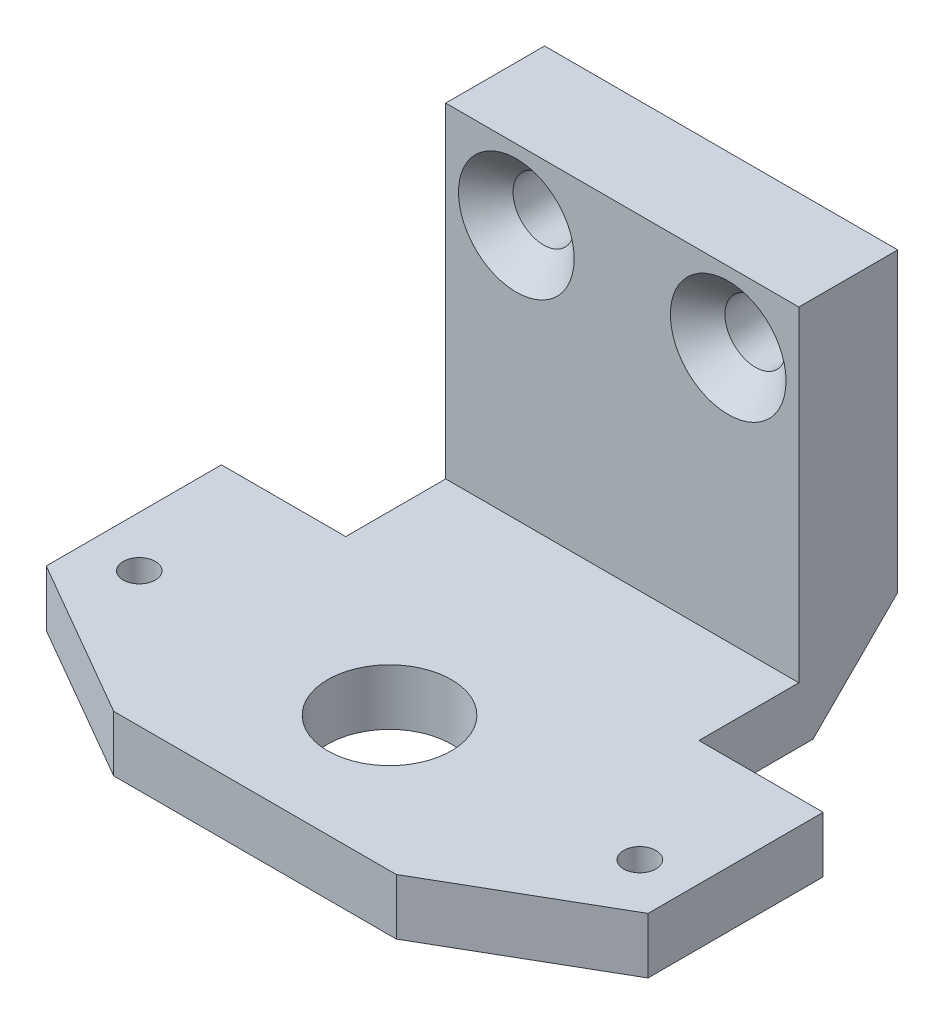
ISO-10303-21;
HEADER;
FILE_DESCRIPTION(('STEP AP214'),'2;1');
FILE_NAME('part.step','',(''),(''),'','','');
FILE_SCHEMA(('AUTOMOTIVE_DESIGN { 1 0 10303 214 1 1 1 1 }'));
ENDSEC;
DATA;
#1=APPLICATION_CONTEXT('core data for automotive mechanical design processes');
#2=APPLICATION_PROTOCOL_DEFINITION('international standard','automotive_design',2000,#1);
#3=PRODUCT_CONTEXT('',#1,'mechanical');
#4=PRODUCT('Part','Part','',(#3));
#5=PRODUCT_RELATED_PRODUCT_CATEGORY('part','',(#4));
#6=PRODUCT_DEFINITION_FORMATION('','',#4);
#7=PRODUCT_DEFINITION_CONTEXT('part definition',#1,'design');
#8=PRODUCT_DEFINITION('design','',#6,#7);
#9=PRODUCT_DEFINITION_SHAPE('','',#8);
#10=(LENGTH_UNIT() NAMED_UNIT(*) SI_UNIT(.MILLI.,.METRE.));
#11=(NAMED_UNIT(*) PLANE_ANGLE_UNIT() SI_UNIT($,.RADIAN.));
#12=(NAMED_UNIT(*) SI_UNIT($,.STERADIAN.) SOLID_ANGLE_UNIT());
#13=UNCERTAINTY_MEASURE_WITH_UNIT(LENGTH_MEASURE(1.E-05),#10,'distance_accuracy_value','');
#14=(GEOMETRIC_REPRESENTATION_CONTEXT(3) GLOBAL_UNCERTAINTY_ASSIGNED_CONTEXT((#13)) GLOBAL_UNIT_ASSIGNED_CONTEXT((#10,
#11,#12)) REPRESENTATION_CONTEXT('',''));
#15=CARTESIAN_POINT('',(0.,0.,0.));
#16=DIRECTION('',(0.,0.,1.));
#17=DIRECTION('',(1.,0.,0.));
#18=AXIS2_PLACEMENT_3D('',#15,#16,#17);
#19=CARTESIAN_POINT('',(0.,5.0292,0.));
#20=DIRECTION('',(0.,-1.,0.));
#21=DIRECTION('',(0.,0.,-1.));
#22=AXIS2_PLACEMENT_3D('',#19,#20,#21);
#23=PLANE('',#22);
#24=CARTESIAN_POINT('',(0.,5.0292,4.064));
#25=DIRECTION('',(0.,1.,0.));
#26=DIRECTION('',(0.,0.,1.));
#27=AXIS2_PLACEMENT_3D('',#24,#25,#26);
#28=CIRCLE('',#27,5.55625);
#29=CARTESIAN_POINT('',(0.,5.0292,9.62025));
#30=VERTEX_POINT('',#29);
#31=EDGE_CURVE('E359',#30,#30,#28,.T.);
#32=ORIENTED_EDGE('',*,*,#31,.F.);
#33=EDGE_LOOP('',(#32));
#34=FACE_BOUND('',#33,.T.);
#35=DIRECTION('',(0.,0.,-1.));
#36=VECTOR('',#35,1.);
#37=CARTESIAN_POINT('',(-27.051,5.0292,7.874));
#38=LINE('',#37,#36);
#39=CARTESIAN_POINT('',(-27.051,5.0292,7.874));
#40=VERTEX_POINT('',#39);
#41=CARTESIAN_POINT('',(-27.051,5.0292,-7.874));
#42=VERTEX_POINT('',#41);
#43=EDGE_CURVE('E186',#40,#42,#38,.T.);
#44=ORIENTED_EDGE('',*,*,#43,.F.);
#45=DIRECTION('',(-0.866025403784438,0.,-0.500000000000001));
#46=VECTOR('',#45,1.);
#47=CARTESIAN_POINT('',(-12.7,5.0292,16.1595537131403));
#48=LINE('',#47,#46);
#49=CARTESIAN_POINT('',(-12.7,5.0292,16.1595537131403));
#50=VERTEX_POINT('',#49);
#51=EDGE_CURVE('E223',#50,#40,#48,.T.);
#52=ORIENTED_EDGE('',*,*,#51,.F.);
#53=DIRECTION('',(-1.,0.,0.));
#54=VECTOR('',#53,1.);
#55=CARTESIAN_POINT('',(12.7,5.0292,16.1595537131403));
#56=LINE('',#55,#54);
#57=CARTESIAN_POINT('',(12.7,5.0292,16.1595537131403));
#58=VERTEX_POINT('',#57);
#59=EDGE_CURVE('E219',#58,#50,#56,.T.);
#60=ORIENTED_EDGE('',*,*,#59,.F.);
#61=DIRECTION('',(-0.866025403784438,0.,0.500000000000001));
#62=VECTOR('',#61,1.);
#63=CARTESIAN_POINT('',(27.051,5.0292,7.874));
#64=LINE('',#63,#62);
#65=CARTESIAN_POINT('',(27.051,5.0292,7.874));
#66=VERTEX_POINT('',#65);
#67=EDGE_CURVE('E215',#66,#58,#64,.T.);
#68=ORIENTED_EDGE('',*,*,#67,.F.);
#69=DIRECTION('',(0.,0.,1.));
#70=VECTOR('',#69,1.);
#71=CARTESIAN_POINT('',(27.051,5.0292,-7.874));
#72=LINE('',#71,#70);
#73=CARTESIAN_POINT('',(27.051,5.0292,-7.874));
#74=VERTEX_POINT('',#73);
#75=EDGE_CURVE('E211',#74,#66,#72,.T.);
#76=ORIENTED_EDGE('',*,*,#75,.F.);
#77=DIRECTION('',(1.,0.,0.));
#78=VECTOR('',#77,1.);
#79=CARTESIAN_POINT('',(15.875,5.0292,-7.874));
#80=LINE('',#79,#78);
#81=CARTESIAN_POINT('',(15.875,5.0292,-7.874));
#82=VERTEX_POINT('',#81);
#83=EDGE_CURVE('E207',#82,#74,#80,.T.);
#84=ORIENTED_EDGE('',*,*,#83,.F.);
#85=DIRECTION('',(0.,0.,1.));
#86=VECTOR('',#85,1.);
#87=CARTESIAN_POINT('',(15.875,5.0292,-16.8604462868597));
#88=LINE('',#87,#86);
#89=CARTESIAN_POINT('',(15.875,5.0292,-16.8604462868597));
#90=VERTEX_POINT('',#89);
#91=EDGE_CURVE('E203',#90,#82,#88,.T.);
#92=ORIENTED_EDGE('',*,*,#91,.F.);
#93=DIRECTION('',(1.,0.,0.));
#94=VECTOR('',#93,1.);
#95=CARTESIAN_POINT('',(-15.875,5.0292,-16.8604462868597));
#96=LINE('',#95,#94);
#97=CARTESIAN_POINT('',(-15.875,5.0292,-16.8604462868597));
#98=VERTEX_POINT('',#97);
#99=EDGE_CURVE('E199',#98,#90,#96,.T.);
#100=ORIENTED_EDGE('',*,*,#99,.F.);
#101=DIRECTION('',(0.,0.,-1.));
#102=VECTOR('',#101,1.);
#103=CARTESIAN_POINT('',(-15.875,5.0292,-7.874));
#104=LINE('',#103,#102);
#105=CARTESIAN_POINT('',(-15.875,5.0292,-7.874));
#106=VERTEX_POINT('',#105);
#107=EDGE_CURVE('E195',#106,#98,#104,.T.);
#108=ORIENTED_EDGE('',*,*,#107,.F.);
#109=DIRECTION('',(1.,0.,0.));
#110=VECTOR('',#109,1.);
#111=CARTESIAN_POINT('',(-27.051,5.0292,-7.874));
#112=LINE('',#111,#110);
#113=EDGE_CURVE('E190',#42,#106,#112,.T.);
#114=ORIENTED_EDGE('',*,*,#113,.F.);
#115=EDGE_LOOP('',(#44,#52,#60,#68,#76,#84,#92,#100,#108,#114));
#116=FACE_BOUND('',#115,.T.);
#117=CARTESIAN_POINT('',(22.5,5.0292,4.064));
#118=DIRECTION('',(0.,1.,0.));
#119=DIRECTION('',(0.,0.,1.));
#120=AXIS2_PLACEMENT_3D('',#117,#118,#119);
#121=CIRCLE('',#120,1.45);
#122=CARTESIAN_POINT('',(22.5,5.0292,5.514));
#123=VERTEX_POINT('',#122);
#124=EDGE_CURVE('E494',#123,#123,#121,.T.);
#125=ORIENTED_EDGE('',*,*,#124,.F.);
#126=EDGE_LOOP('',(#125));
#127=FACE_BOUND('',#126,.T.);
#128=CARTESIAN_POINT('',(-22.5,5.0292,4.064));
#129=DIRECTION('',(0.,1.,0.));
#130=DIRECTION('',(0.,0.,1.));
#131=AXIS2_PLACEMENT_3D('',#128,#129,#130);
#132=CIRCLE('',#131,1.45);
#133=CARTESIAN_POINT('',(-22.5,5.0292,5.514));
#134=VERTEX_POINT('',#133);
#135=EDGE_CURVE('E492',#134,#134,#132,.T.);
#136=ORIENTED_EDGE('',*,*,#135,.F.);
#137=EDGE_LOOP('',(#136));
#138=FACE_BOUND('',#137,.T.);
#139=ADVANCED_FACE('F39',(#34,#116,#127,#138),#23,.F.);
#140=CARTESIAN_POINT('',(15.875,5.0292,-16.8604462868597));
#141=DIRECTION('',(1.,0.,0.));
#142=DIRECTION('',(0.,0.,-1.));
#143=AXIS2_PLACEMENT_3D('',#140,#141,#142);
#144=PLANE('',#143);
#145=DIRECTION('',(0.,0.,1.));
#146=VECTOR('',#145,1.);
#147=CARTESIAN_POINT('',(15.875,0.,-16.8604462868597));
#148=LINE('',#147,#146);
#149=CARTESIAN_POINT('',(15.875,0.,-18.1304462868597));
#150=VERTEX_POINT('',#149);
#151=CARTESIAN_POINT('',(15.875,0.,-7.874));
#152=VERTEX_POINT('',#151);
#153=EDGE_CURVE('E152',#150,#152,#148,.T.);
#154=ORIENTED_EDGE('',*,*,#153,.F.);
#155=DIRECTION('',(0.,0.707106781186548,-0.707106781186548));
#156=VECTOR('',#155,1.);
#157=CARTESIAN_POINT('',(15.875,1.8796,-20.0100462868597));
#158=LINE('',#157,#156);
#159=CARTESIAN_POINT('',(15.8750000000001,7.62,-25.7504462868597));
#160=VERTEX_POINT('',#159);
#161=EDGE_CURVE('E149',#150,#160,#158,.T.);
#162=ORIENTED_EDGE('',*,*,#161,.T.);
#163=DIRECTION('',(0.,-1.,0.));
#164=VECTOR('',#163,1.);
#165=CARTESIAN_POINT('',(15.875,34.29,-25.7504462868597));
#166=LINE('',#165,#164);
#167=CARTESIAN_POINT('',(15.875,34.29,-25.7504462868597));
#168=VERTEX_POINT('',#167);
#169=EDGE_CURVE('E137',#168,#160,#166,.T.);
#170=ORIENTED_EDGE('',*,*,#169,.F.);
#171=DIRECTION('',(0.,0.,-1.));
#172=VECTOR('',#171,1.);
#173=CARTESIAN_POINT('',(15.875,34.29,-25.7504462868597));
#174=LINE('',#173,#172);
#175=CARTESIAN_POINT('',(15.875,34.29,-16.8604462868597));
#176=VERTEX_POINT('',#175);
#177=EDGE_CURVE('E171',#176,#168,#174,.T.);
#178=ORIENTED_EDGE('',*,*,#177,.F.);
#179=DIRECTION('',(0.,-1.,0.));
#180=VECTOR('',#179,1.);
#181=CARTESIAN_POINT('',(15.875,34.29,-16.8604462868597));
#182=LINE('',#181,#180);
#183=EDGE_CURVE('E145',#176,#90,#182,.T.);
#184=ORIENTED_EDGE('',*,*,#183,.T.);
#185=ORIENTED_EDGE('',*,*,#91,.T.);
#186=DIRECTION('',(0.,-1.,0.));
#187=VECTOR('',#186,1.);
#188=CARTESIAN_POINT('',(15.875,5.0292,-7.874));
#189=LINE('',#188,#187);
#190=EDGE_CURVE('E273',#82,#152,#189,.T.);
#191=ORIENTED_EDGE('',*,*,#190,.T.);
#192=EDGE_LOOP('',(#154,#162,#170,#178,#184,#185,#191));
#193=FACE_BOUND('',#192,.T.);
#194=ADVANCED_FACE('F150',(#193),#144,.T.);
#195=CARTESIAN_POINT('',(-15.875,5.0292,-7.874));
#196=DIRECTION('',(-1.,0.,0.));
#197=DIRECTION('',(0.,0.,1.));
#198=AXIS2_PLACEMENT_3D('',#195,#196,#197);
#199=PLANE('',#198);
#200=DIRECTION('',(0.,-1.,0.));
#201=VECTOR('',#200,1.);
#202=CARTESIAN_POINT('',(-15.875,34.29,-25.7504462868597));
#203=LINE('',#202,#201);
#204=CARTESIAN_POINT('',(-15.875,34.29,-25.7504462868597));
#205=VERTEX_POINT('',#204);
#206=CARTESIAN_POINT('',(-15.875,7.62,-25.7504462868597));
#207=VERTEX_POINT('',#206);
#208=EDGE_CURVE('E146',#205,#207,#203,.T.);
#209=ORIENTED_EDGE('',*,*,#208,.T.);
#210=DIRECTION('',(0.,-0.707106781186548,0.707106781186548));
#211=VECTOR('',#210,1.);
#212=CARTESIAN_POINT('',(-15.875,-2.61362314342983,-15.5168231434298));
#213=LINE('',#212,#211);
#214=CARTESIAN_POINT('',(-15.875,0.,-18.1304462868597));
#215=VERTEX_POINT('',#214);
#216=EDGE_CURVE('E63',#207,#215,#213,.T.);
#217=ORIENTED_EDGE('',*,*,#216,.T.);
#218=DIRECTION('',(0.,0.,-1.));
#219=VECTOR('',#218,1.);
#220=CARTESIAN_POINT('',(-15.875,0.,-7.874));
#221=LINE('',#220,#219);
#222=CARTESIAN_POINT('',(-15.875,0.,-7.874));
#223=VERTEX_POINT('',#222);
#224=EDGE_CURVE('E235',#223,#215,#221,.T.);
#225=ORIENTED_EDGE('',*,*,#224,.F.);
#226=DIRECTION('',(0.,-1.,0.));
#227=VECTOR('',#226,1.);
#228=CARTESIAN_POINT('',(-15.875,5.0292,-7.874));
#229=LINE('',#228,#227);
#230=EDGE_CURVE('E276',#106,#223,#229,.T.);
#231=ORIENTED_EDGE('',*,*,#230,.F.);
#232=ORIENTED_EDGE('',*,*,#107,.T.);
#233=DIRECTION('',(0.,-1.,0.));
#234=VECTOR('',#233,1.);
#235=CARTESIAN_POINT('',(-15.875,34.29,-16.8604462868597));
#236=LINE('',#235,#234);
#237=CARTESIAN_POINT('',(-15.875,34.29,-16.8604462868597));
#238=VERTEX_POINT('',#237);
#239=EDGE_CURVE('E181',#238,#98,#236,.T.);
#240=ORIENTED_EDGE('',*,*,#239,.F.);
#241=DIRECTION('',(0.,0.,1.));
#242=VECTOR('',#241,1.);
#243=CARTESIAN_POINT('',(-15.875,34.29,-25.7504462868597));
#244=LINE('',#243,#242);
#245=EDGE_CURVE('E155',#205,#238,#244,.T.);
#246=ORIENTED_EDGE('',*,*,#245,.F.);
#247=EDGE_LOOP('',(#209,#217,#225,#231,#232,#240,#246));
#248=FACE_BOUND('',#247,.T.);
#249=ADVANCED_FACE('F297',(#248),#199,.T.);
#250=CARTESIAN_POINT('',(0.,0.,0.));
#251=DIRECTION('',(0.,-1.,0.));
#252=DIRECTION('',(0.,0.,-1.));
#253=AXIS2_PLACEMENT_3D('',#250,#251,#252);
#254=PLANE('',#253);
#255=CARTESIAN_POINT('',(-22.5,0.,4.064));
#256=DIRECTION('',(0.,-1.,0.));
#257=DIRECTION('',(0.,0.,-1.));
#258=AXIS2_PLACEMENT_3D('',#255,#256,#257);
#259=CIRCLE('',#258,1.45);
#260=CARTESIAN_POINT('',(-22.5,0.,2.614));
#261=VERTEX_POINT('',#260);
#262=EDGE_CURVE('E348',#261,#261,#259,.T.);
#263=ORIENTED_EDGE('',*,*,#262,.F.);
#264=EDGE_LOOP('',(#263));
#265=FACE_BOUND('',#264,.T.);
#266=CARTESIAN_POINT('',(22.5,0.,4.064));
#267=DIRECTION('',(0.,-1.,0.));
#268=DIRECTION('',(0.,0.,-1.));
#269=AXIS2_PLACEMENT_3D('',#266,#267,#268);
#270=CIRCLE('',#269,1.45);
#271=CARTESIAN_POINT('',(22.5,0.,2.614));
#272=VERTEX_POINT('',#271);
#273=EDGE_CURVE('E352',#272,#272,#270,.T.);
#274=ORIENTED_EDGE('',*,*,#273,.F.);
#275=EDGE_LOOP('',(#274));
#276=FACE_BOUND('',#275,.T.);
#277=CARTESIAN_POINT('',(0.,0.,4.064));
#278=DIRECTION('',(0.,1.,0.));
#279=DIRECTION('',(0.,0.,1.));
#280=AXIS2_PLACEMENT_3D('',#277,#278,#279);
#281=CIRCLE('',#280,5.55625);
#282=CARTESIAN_POINT('',(0.,0.,9.62025));
#283=VERTEX_POINT('',#282);
#284=EDGE_CURVE('E355',#283,#283,#281,.T.);
#285=ORIENTED_EDGE('',*,*,#284,.T.);
#286=EDGE_LOOP('',(#285));
#287=FACE_BOUND('',#286,.T.);
#288=ORIENTED_EDGE('',*,*,#224,.T.);
#289=DIRECTION('',(-1.,0.,0.));
#290=VECTOR('',#289,1.);
#291=CARTESIAN_POINT('',(165.214906004187,0.,-18.1304462868597));
#292=LINE('',#291,#290);
#293=EDGE_CURVE('E55',#150,#215,#292,.T.);
#294=ORIENTED_EDGE('',*,*,#293,.F.);
#295=ORIENTED_EDGE('',*,*,#153,.T.);
#296=DIRECTION('',(1.,0.,0.));
#297=VECTOR('',#296,1.);
#298=CARTESIAN_POINT('',(15.875,0.,-7.874));
#299=LINE('',#298,#297);
#300=CARTESIAN_POINT('',(27.051,0.,-7.874));
#301=VERTEX_POINT('',#300);
#302=EDGE_CURVE('E240',#152,#301,#299,.T.);
#303=ORIENTED_EDGE('',*,*,#302,.T.);
#304=DIRECTION('',(0.,0.,1.));
#305=VECTOR('',#304,1.);
#306=CARTESIAN_POINT('',(27.051,0.,-7.874));
#307=LINE('',#306,#305);
#308=CARTESIAN_POINT('',(27.051,0.,7.874));
#309=VERTEX_POINT('',#308);
#310=EDGE_CURVE('E244',#301,#309,#307,.T.);
#311=ORIENTED_EDGE('',*,*,#310,.T.);
#312=DIRECTION('',(-0.866025403784438,0.,0.500000000000001));
#313=VECTOR('',#312,1.);
#314=CARTESIAN_POINT('',(27.051,0.,7.874));
#315=LINE('',#314,#313);
#316=CARTESIAN_POINT('',(12.7,0.,16.1595537131403));
#317=VERTEX_POINT('',#316);
#318=EDGE_CURVE('E248',#309,#317,#315,.T.);
#319=ORIENTED_EDGE('',*,*,#318,.T.);
#320=DIRECTION('',(-1.,0.,0.));
#321=VECTOR('',#320,1.);
#322=CARTESIAN_POINT('',(12.7,0.,16.1595537131403));
#323=LINE('',#322,#321);
#324=CARTESIAN_POINT('',(-12.7,0.,16.1595537131403));
#325=VERTEX_POINT('',#324);
#326=EDGE_CURVE('E252',#317,#325,#323,.T.);
#327=ORIENTED_EDGE('',*,*,#326,.T.);
#328=DIRECTION('',(-0.866025403784438,0.,-0.500000000000001));
#329=VECTOR('',#328,1.);
#330=CARTESIAN_POINT('',(-12.7,0.,16.1595537131403));
#331=LINE('',#330,#329);
#332=CARTESIAN_POINT('',(-27.051,0.,7.874));
#333=VERTEX_POINT('',#332);
#334=EDGE_CURVE('E191',#325,#333,#331,.T.);
#335=ORIENTED_EDGE('',*,*,#334,.T.);
#336=DIRECTION('',(0.,0.,-1.));
#337=VECTOR('',#336,1.);
#338=CARTESIAN_POINT('',(-27.051,0.,7.874));
#339=LINE('',#338,#337);
#340=CARTESIAN_POINT('',(-27.051,0.,-7.874));
#341=VERTEX_POINT('',#340);
#342=EDGE_CURVE('E185',#333,#341,#339,.T.);
#343=ORIENTED_EDGE('',*,*,#342,.T.);
#344=DIRECTION('',(1.,0.,0.));
#345=VECTOR('',#344,1.);
#346=CARTESIAN_POINT('',(-27.051,0.,-7.874));
#347=LINE('',#346,#345);
#348=EDGE_CURVE('E231',#341,#223,#347,.T.);
#349=ORIENTED_EDGE('',*,*,#348,.T.);
#350=EDGE_LOOP('',(#288,#294,#295,#303,#311,#319,#327,#335,#343,#349));
#351=FACE_BOUND('',#350,.T.);
#352=ADVANCED_FACE('F286',(#265,#276,#287,#351),#254,.T.);
#353=CARTESIAN_POINT('',(15.875,34.29,-25.7504462868597));
#354=DIRECTION('',(0.,0.,1.));
#355=DIRECTION('',(1.,0.,0.));
#356=AXIS2_PLACEMENT_3D('',#353,#354,#355);
#357=PLANE('',#356);
#358=CARTESIAN_POINT('',(-9.525,27.94,-25.7504462868597));
#359=DIRECTION('',(0.,0.,1.));
#360=DIRECTION('',(1.,0.,0.));
#361=AXIS2_PLACEMENT_3D('',#358,#359,#360);
#362=CIRCLE('',#361,2.75);
#363=CARTESIAN_POINT('',(-6.775,27.94,-25.7504462868597));
#364=VERTEX_POINT('',#363);
#365=EDGE_CURVE('E374',#364,#364,#362,.T.);
#366=ORIENTED_EDGE('',*,*,#365,.T.);
#367=EDGE_LOOP('',(#366));
#368=FACE_BOUND('',#367,.T.);
#369=CARTESIAN_POINT('',(9.525,27.94,-25.7504462868597));
#370=DIRECTION('',(0.,0.,1.));
#371=DIRECTION('',(1.,0.,0.));
#372=AXIS2_PLACEMENT_3D('',#369,#370,#371);
#373=CIRCLE('',#372,2.75);
#374=CARTESIAN_POINT('',(12.275,27.94,-25.7504462868597));
#375=VERTEX_POINT('',#374);
#376=EDGE_CURVE('E161',#375,#375,#373,.T.);
#377=ORIENTED_EDGE('',*,*,#376,.T.);
#378=EDGE_LOOP('',(#377));
#379=FACE_BOUND('',#378,.T.);
#380=DIRECTION('',(1.,0.,0.));
#381=VECTOR('',#380,1.);
#382=CARTESIAN_POINT('',(15.875,7.62,-25.7504462868597));
#383=LINE('',#382,#381);
#384=EDGE_CURVE('E11',#207,#160,#383,.T.);
#385=ORIENTED_EDGE('',*,*,#384,.F.);
#386=ORIENTED_EDGE('',*,*,#208,.F.);
#387=DIRECTION('',(-1.,0.,0.));
#388=VECTOR('',#387,1.);
#389=CARTESIAN_POINT('',(15.875,34.29,-25.7504462868597));
#390=LINE('',#389,#388);
#391=EDGE_CURVE('E141',#168,#205,#390,.T.);
#392=ORIENTED_EDGE('',*,*,#391,.F.);
#393=ORIENTED_EDGE('',*,*,#169,.T.);
#394=EDGE_LOOP('',(#385,#386,#392,#393));
#395=FACE_BOUND('',#394,.T.);
#396=ADVANCED_FACE('F139',(#368,#379,#395),#357,.F.);
#397=CARTESIAN_POINT('',(-27.051,5.0292,7.874));
#398=DIRECTION('',(-1.,0.,0.));
#399=DIRECTION('',(0.,0.,1.));
#400=AXIS2_PLACEMENT_3D('',#397,#398,#399);
#401=PLANE('',#400);
#402=ORIENTED_EDGE('',*,*,#342,.F.);
#403=DIRECTION('',(0.,-1.,0.));
#404=VECTOR('',#403,1.);
#405=CARTESIAN_POINT('',(-27.051,5.0292,7.874));
#406=LINE('',#405,#404);
#407=EDGE_CURVE('E48',#40,#333,#406,.T.);
#408=ORIENTED_EDGE('',*,*,#407,.F.);
#409=ORIENTED_EDGE('',*,*,#43,.T.);
#410=DIRECTION('',(0.,-1.,0.));
#411=VECTOR('',#410,1.);
#412=CARTESIAN_POINT('',(-27.051,5.0292,-7.874));
#413=LINE('',#412,#411);
#414=EDGE_CURVE('E227',#42,#341,#413,.T.);
#415=ORIENTED_EDGE('',*,*,#414,.T.);
#416=EDGE_LOOP('',(#402,#408,#409,#415));
#417=FACE_BOUND('',#416,.T.);
#418=ADVANCED_FACE('F41',(#417),#401,.T.);
#419=CARTESIAN_POINT('',(-12.7,5.0292,16.1595537131403));
#420=DIRECTION('',(-0.500000000000001,0.,0.866025403784438));
#421=DIRECTION('',(0.866025403784438,0.,0.500000000000001));
#422=AXIS2_PLACEMENT_3D('',#419,#420,#421);
#423=PLANE('',#422);
#424=ORIENTED_EDGE('',*,*,#334,.F.);
#425=DIRECTION('',(0.,-1.,0.));
#426=VECTOR('',#425,1.);
#427=CARTESIAN_POINT('',(-12.7,5.0292,16.1595537131403));
#428=LINE('',#427,#426);
#429=EDGE_CURVE('E261',#50,#325,#428,.T.);
#430=ORIENTED_EDGE('',*,*,#429,.F.);
#431=ORIENTED_EDGE('',*,*,#51,.T.);
#432=ORIENTED_EDGE('',*,*,#407,.T.);
#433=EDGE_LOOP('',(#424,#430,#431,#432));
#434=FACE_BOUND('',#433,.T.);
#435=ADVANCED_FACE('F290',(#434),#423,.T.);
#436=CARTESIAN_POINT('',(12.7,5.0292,16.1595537131403));
#437=DIRECTION('',(0.,0.,1.));
#438=DIRECTION('',(1.,0.,0.));
#439=AXIS2_PLACEMENT_3D('',#436,#437,#438);
#440=PLANE('',#439);
#441=ORIENTED_EDGE('',*,*,#326,.F.);
#442=DIRECTION('',(0.,-1.,0.));
#443=VECTOR('',#442,1.);
#444=CARTESIAN_POINT('',(12.7,5.0292,16.1595537131403));
#445=LINE('',#444,#443);
#446=EDGE_CURVE('E264',#58,#317,#445,.T.);
#447=ORIENTED_EDGE('',*,*,#446,.F.);
#448=ORIENTED_EDGE('',*,*,#59,.T.);
#449=ORIENTED_EDGE('',*,*,#429,.T.);
#450=EDGE_LOOP('',(#441,#447,#448,#449));
#451=FACE_BOUND('',#450,.T.);
#452=ADVANCED_FACE('F317',(#451),#440,.T.);
#453=CARTESIAN_POINT('',(27.051,5.0292,7.874));
#454=DIRECTION('',(0.500000000000001,0.,0.866025403784438));
#455=DIRECTION('',(0.866025403784438,0.,-0.500000000000001));
#456=AXIS2_PLACEMENT_3D('',#453,#454,#455);
#457=PLANE('',#456);
#458=ORIENTED_EDGE('',*,*,#318,.F.);
#459=DIRECTION('',(0.,-1.,0.));
#460=VECTOR('',#459,1.);
#461=CARTESIAN_POINT('',(27.051,5.0292,7.874));
#462=LINE('',#461,#460);
#463=EDGE_CURVE('E267',#66,#309,#462,.T.);
#464=ORIENTED_EDGE('',*,*,#463,.F.);
#465=ORIENTED_EDGE('',*,*,#67,.T.);
#466=ORIENTED_EDGE('',*,*,#446,.T.);
#467=EDGE_LOOP('',(#458,#464,#465,#466));
#468=FACE_BOUND('',#467,.T.);
#469=ADVANCED_FACE('F315',(#468),#457,.T.);
#470=CARTESIAN_POINT('',(27.051,5.0292,-7.874));
#471=DIRECTION('',(1.,0.,0.));
#472=DIRECTION('',(0.,0.,-1.));
#473=AXIS2_PLACEMENT_3D('',#470,#471,#472);
#474=PLANE('',#473);
#475=ORIENTED_EDGE('',*,*,#310,.F.);
#476=DIRECTION('',(0.,-1.,0.));
#477=VECTOR('',#476,1.);
#478=CARTESIAN_POINT('',(27.051,5.0292,-7.874));
#479=LINE('',#478,#477);
#480=EDGE_CURVE('E270',#74,#301,#479,.T.);
#481=ORIENTED_EDGE('',*,*,#480,.F.);
#482=ORIENTED_EDGE('',*,*,#75,.T.);
#483=ORIENTED_EDGE('',*,*,#463,.T.);
#484=EDGE_LOOP('',(#475,#481,#482,#483));
#485=FACE_BOUND('',#484,.T.);
#486=ADVANCED_FACE('F313',(#485),#474,.T.);
#487=CARTESIAN_POINT('',(15.875,5.0292,-7.874));
#488=DIRECTION('',(0.,0.,-1.));
#489=DIRECTION('',(-1.,0.,0.));
#490=AXIS2_PLACEMENT_3D('',#487,#488,#489);
#491=PLANE('',#490);
#492=ORIENTED_EDGE('',*,*,#302,.F.);
#493=ORIENTED_EDGE('',*,*,#190,.F.);
#494=ORIENTED_EDGE('',*,*,#83,.T.);
#495=ORIENTED_EDGE('',*,*,#480,.T.);
#496=EDGE_LOOP('',(#492,#493,#494,#495));
#497=FACE_BOUND('',#496,.T.);
#498=ADVANCED_FACE('F309',(#497),#491,.T.);
#499=CARTESIAN_POINT('',(-27.051,5.0292,-7.874));
#500=DIRECTION('',(0.,0.,-1.));
#501=DIRECTION('',(-1.,0.,0.));
#502=AXIS2_PLACEMENT_3D('',#499,#500,#501);
#503=PLANE('',#502);
#504=ORIENTED_EDGE('',*,*,#348,.F.);
#505=ORIENTED_EDGE('',*,*,#414,.F.);
#506=ORIENTED_EDGE('',*,*,#113,.T.);
#507=ORIENTED_EDGE('',*,*,#230,.T.);
#508=EDGE_LOOP('',(#504,#505,#506,#507));
#509=FACE_BOUND('',#508,.T.);
#510=ADVANCED_FACE('F285',(#509),#503,.T.);
#511=CARTESIAN_POINT('',(15.875,34.29,-16.8604462868597));
#512=DIRECTION('',(0.,0.,-1.));
#513=DIRECTION('',(-1.,0.,0.));
#514=AXIS2_PLACEMENT_3D('',#511,#512,#513);
#515=PLANE('',#514);
#516=CARTESIAN_POINT('',(-9.525,27.94,-16.8604462868597));
#517=DIRECTION('',(0.,0.,1.));
#518=DIRECTION('',(1.,0.,0.));
#519=AXIS2_PLACEMENT_3D('',#516,#517,#518);
#520=CIRCLE('',#519,5.2);
#521=CARTESIAN_POINT('',(-4.325,27.94,-16.8604462868597));
#522=VERTEX_POINT('',#521);
#523=EDGE_CURVE('E358',#522,#522,#520,.T.);
#524=ORIENTED_EDGE('',*,*,#523,.F.);
#525=EDGE_LOOP('',(#524));
#526=FACE_BOUND('',#525,.T.);
#527=CARTESIAN_POINT('',(9.525,27.94,-16.8604462868597));
#528=DIRECTION('',(0.,0.,1.));
#529=DIRECTION('',(1.,0.,0.));
#530=AXIS2_PLACEMENT_3D('',#527,#528,#529);
#531=CIRCLE('',#530,5.2);
#532=CARTESIAN_POINT('',(14.725,27.94,-16.8604462868597));
#533=VERTEX_POINT('',#532);
#534=EDGE_CURVE('E378',#533,#533,#531,.T.);
#535=ORIENTED_EDGE('',*,*,#534,.F.);
#536=EDGE_LOOP('',(#535));
#537=FACE_BOUND('',#536,.T.);
#538=ORIENTED_EDGE('',*,*,#239,.T.);
#539=ORIENTED_EDGE('',*,*,#99,.T.);
#540=ORIENTED_EDGE('',*,*,#183,.F.);
#541=DIRECTION('',(1.,0.,0.));
#542=VECTOR('',#541,1.);
#543=CARTESIAN_POINT('',(15.875,34.29,-16.8604462868597));
#544=LINE('',#543,#542);
#545=EDGE_CURVE('E168',#238,#176,#544,.T.);
#546=ORIENTED_EDGE('',*,*,#545,.F.);
#547=EDGE_LOOP('',(#538,#539,#540,#546));
#548=FACE_BOUND('',#547,.T.);
#549=ADVANCED_FACE('F300',(#526,#537,#548),#515,.F.);
#550=CARTESIAN_POINT('',(0.,34.29,0.));
#551=DIRECTION('',(0.,-1.,0.));
#552=DIRECTION('',(0.,0.,-1.));
#553=AXIS2_PLACEMENT_3D('',#550,#551,#552);
#554=PLANE('',#553);
#555=ORIENTED_EDGE('',*,*,#245,.T.);
#556=ORIENTED_EDGE('',*,*,#545,.T.);
#557=ORIENTED_EDGE('',*,*,#177,.T.);
#558=ORIENTED_EDGE('',*,*,#391,.T.);
#559=EDGE_LOOP('',(#555,#556,#557,#558));
#560=FACE_BOUND('',#559,.T.);
#561=ADVANCED_FACE('F303',(#560),#554,.F.);
#562=CARTESIAN_POINT('',(165.214906004187,7.62,-25.7504462868597));
#563=DIRECTION('',(0.,-0.707106781186548,-0.707106781186548));
#564=DIRECTION('',(0.,0.707106781186548,-0.707106781186548));
#565=AXIS2_PLACEMENT_3D('',#562,#563,#564);
#566=PLANE('',#565);
#567=ORIENTED_EDGE('',*,*,#161,.F.);
#568=ORIENTED_EDGE('',*,*,#293,.T.);
#569=ORIENTED_EDGE('',*,*,#216,.F.);
#570=ORIENTED_EDGE('',*,*,#384,.T.);
#571=EDGE_LOOP('',(#567,#568,#569,#570));
#572=FACE_BOUND('',#571,.T.);
#573=ADVANCED_FACE('F157',(#572),#566,.T.);
#574=CARTESIAN_POINT('',(9.525,27.94,-16.8604462868597));
#575=DIRECTION('',(0.,0.,1.));
#576=DIRECTION('',(1.,0.,0.));
#577=AXIS2_PLACEMENT_3D('',#574,#575,#576);
#578=CYLINDRICAL_SURFACE('',#577,2.75);
#579=ORIENTED_EDGE('',*,*,#376,.F.);
#580=EDGE_LOOP('',(#579));
#581=FACE_BOUND('',#580,.T.);
#582=CARTESIAN_POINT('',(9.525,27.94,-19.3104462868597));
#583=DIRECTION('',(0.,0.,1.));
#584=DIRECTION('',(1.,0.,0.));
#585=AXIS2_PLACEMENT_3D('',#582,#583,#584);
#586=CIRCLE('',#585,2.75);
#587=CARTESIAN_POINT('',(12.275,27.94,-19.3104462868597));
#588=VERTEX_POINT('',#587);
#589=EDGE_CURVE('E382',#588,#588,#586,.T.);
#590=ORIENTED_EDGE('',*,*,#589,.T.);
#591=EDGE_LOOP('',(#590));
#592=FACE_BOUND('',#591,.T.);
#593=ADVANCED_FACE('F390',(#581,#592),#578,.F.);
#594=CARTESIAN_POINT('',(9.525,27.94,-16.8604462868597));
#595=DIRECTION('',(0.,0.,1.));
#596=DIRECTION('',(1.,0.,0.));
#597=AXIS2_PLACEMENT_3D('',#594,#595,#596);
#598=CONICAL_SURFACE('',#597,5.2,0.785398163397449);
#599=ORIENTED_EDGE('',*,*,#589,.F.);
#600=EDGE_LOOP('',(#599));
#601=FACE_BOUND('',#600,.T.);
#602=ORIENTED_EDGE('',*,*,#534,.T.);
#603=EDGE_LOOP('',(#602));
#604=FACE_BOUND('',#603,.T.);
#605=ADVANCED_FACE('F393',(#601,#604),#598,.F.);
#606=CARTESIAN_POINT('',(-9.525,27.94,-16.8604462868597));
#607=DIRECTION('',(0.,0.,1.));
#608=DIRECTION('',(1.,0.,0.));
#609=AXIS2_PLACEMENT_3D('',#606,#607,#608);
#610=CYLINDRICAL_SURFACE('',#609,2.75);
#611=ORIENTED_EDGE('',*,*,#365,.F.);
#612=EDGE_LOOP('',(#611));
#613=FACE_BOUND('',#612,.T.);
#614=CARTESIAN_POINT('',(-9.525,27.94,-19.3104462868597));
#615=DIRECTION('',(0.,0.,1.));
#616=DIRECTION('',(1.,0.,0.));
#617=AXIS2_PLACEMENT_3D('',#614,#615,#616);
#618=CIRCLE('',#617,2.75);
#619=CARTESIAN_POINT('',(-6.775,27.94,-19.3104462868597));
#620=VERTEX_POINT('',#619);
#621=EDGE_CURVE('E364',#620,#620,#618,.T.);
#622=ORIENTED_EDGE('',*,*,#621,.T.);
#623=EDGE_LOOP('',(#622));
#624=FACE_BOUND('',#623,.T.);
#625=ADVANCED_FACE('F399',(#613,#624),#610,.F.);
#626=CARTESIAN_POINT('',(-9.525,27.94,-16.8604462868597));
#627=DIRECTION('',(0.,0.,1.));
#628=DIRECTION('',(1.,0.,0.));
#629=AXIS2_PLACEMENT_3D('',#626,#627,#628);
#630=CONICAL_SURFACE('',#629,5.2,0.785398163397449);
#631=ORIENTED_EDGE('',*,*,#621,.F.);
#632=EDGE_LOOP('',(#631));
#633=FACE_BOUND('',#632,.T.);
#634=ORIENTED_EDGE('',*,*,#523,.T.);
#635=EDGE_LOOP('',(#634));
#636=FACE_BOUND('',#635,.T.);
#637=ADVANCED_FACE('F412',(#633,#636),#630,.F.);
#638=CARTESIAN_POINT('',(0.,0.,4.064));
#639=DIRECTION('',(0.,1.,0.));
#640=DIRECTION('',(0.,0.,1.));
#641=AXIS2_PLACEMENT_3D('',#638,#639,#640);
#642=CYLINDRICAL_SURFACE('',#641,5.55625);
#643=ORIENTED_EDGE('',*,*,#284,.F.);
#644=EDGE_LOOP('',(#643));
#645=FACE_BOUND('',#644,.T.);
#646=ORIENTED_EDGE('',*,*,#31,.T.);
#647=EDGE_LOOP('',(#646));
#648=FACE_BOUND('',#647,.T.);
#649=ADVANCED_FACE('F414',(#645,#648),#642,.F.);
#650=CARTESIAN_POINT('',(22.5,5.0292,4.064));
#651=DIRECTION('',(0.,1.,0.));
#652=DIRECTION('',(0.,0.,1.));
#653=AXIS2_PLACEMENT_3D('',#650,#651,#652);
#654=CYLINDRICAL_SURFACE('',#653,1.45);
#655=ORIENTED_EDGE('',*,*,#124,.T.);
#656=EDGE_LOOP('',(#655));
#657=FACE_BOUND('',#656,.T.);
#658=ORIENTED_EDGE('',*,*,#273,.T.);
#659=EDGE_LOOP('',(#658));
#660=FACE_BOUND('',#659,.T.);
#661=ADVANCED_FACE('F421',(#657,#660),#654,.F.);
#662=CARTESIAN_POINT('',(-22.5,5.0292,4.064));
#663=DIRECTION('',(0.,1.,0.));
#664=DIRECTION('',(0.,0.,1.));
#665=AXIS2_PLACEMENT_3D('',#662,#663,#664);
#666=CYLINDRICAL_SURFACE('',#665,1.45);
#667=ORIENTED_EDGE('',*,*,#135,.T.);
#668=EDGE_LOOP('',(#667));
#669=FACE_BOUND('',#668,.T.);
#670=ORIENTED_EDGE('',*,*,#262,.T.);
#671=EDGE_LOOP('',(#670));
#672=FACE_BOUND('',#671,.T.);
#673=ADVANCED_FACE('F476',(#669,#672),#666,.F.);
#674=CLOSED_SHELL('',(#139,#194,#249,#352,#396,#418,#435,#452,#469,#486,#498,#510,#549,#561,
#573,#593,#605,#625,#637,#649,#661,#673));
#675=MANIFOLD_SOLID_BREP('B2',#674);
#676=ADVANCED_BREP_SHAPE_REPRESENTATION('',(#18,#675),#14);
#677=SHAPE_DEFINITION_REPRESENTATION(#9,#676);
ENDSEC;
END-ISO-10303-21;
